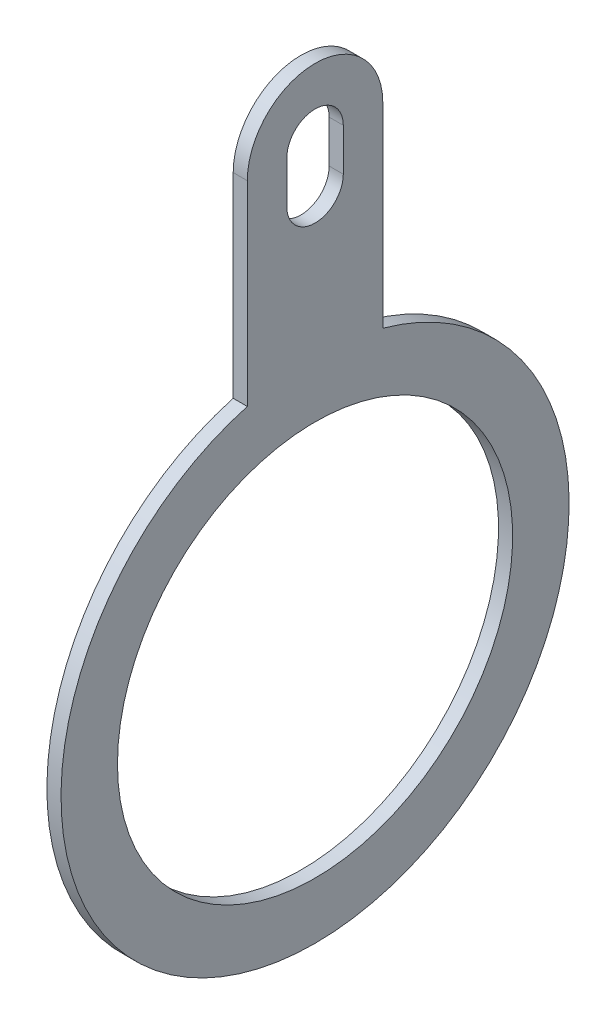
ISO-10303-21;
HEADER;
FILE_DESCRIPTION(('STEP AP214'),'2;1');
FILE_NAME('part.step','',(''),(''),'','','');
FILE_SCHEMA(('AUTOMOTIVE_DESIGN { 1 0 10303 214 1 1 1 1 }'));
ENDSEC;
DATA;
#1=APPLICATION_CONTEXT('core data for automotive mechanical design processes');
#2=APPLICATION_PROTOCOL_DEFINITION('international standard','automotive_design',2000,#1);
#3=PRODUCT_CONTEXT('',#1,'mechanical');
#4=PRODUCT('Part','Part','',(#3));
#5=PRODUCT_RELATED_PRODUCT_CATEGORY('part','',(#4));
#6=PRODUCT_DEFINITION_FORMATION('','',#4);
#7=PRODUCT_DEFINITION_CONTEXT('part definition',#1,'design');
#8=PRODUCT_DEFINITION('design','',#6,#7);
#9=PRODUCT_DEFINITION_SHAPE('','',#8);
#10=(LENGTH_UNIT() NAMED_UNIT(*) SI_UNIT(.MILLI.,.METRE.));
#11=(NAMED_UNIT(*) PLANE_ANGLE_UNIT() SI_UNIT($,.RADIAN.));
#12=(NAMED_UNIT(*) SI_UNIT($,.STERADIAN.) SOLID_ANGLE_UNIT());
#13=UNCERTAINTY_MEASURE_WITH_UNIT(LENGTH_MEASURE(1.E-05),#10,'distance_accuracy_value','');
#14=(GEOMETRIC_REPRESENTATION_CONTEXT(3) GLOBAL_UNCERTAINTY_ASSIGNED_CONTEXT((#13)) GLOBAL_UNIT_ASSIGNED_CONTEXT((#10,
#11,#12)) REPRESENTATION_CONTEXT('',''));
#15=CARTESIAN_POINT('',(0.,0.,0.));
#16=DIRECTION('',(0.,0.,1.));
#17=DIRECTION('',(1.,0.,0.));
#18=AXIS2_PLACEMENT_3D('',#15,#16,#17);
#19=CARTESIAN_POINT('',(-1.35,-102.5400760809,9.364816595064));
#20=DIRECTION('',(1.,0.,0.));
#21=DIRECTION('',(0.,0.,-1.));
#22=AXIS2_PLACEMENT_3D('',#19,#20,#21);
#23=PLANE('',#22);
#24=CARTESIAN_POINT('',(-1.34999999999981,-78.9,0.));
#25=DIRECTION('',(1.,0.,0.));
#26=DIRECTION('',(0.,0.,-1.));
#27=AXIS2_PLACEMENT_3D('',#24,#25,#26);
#28=CIRCLE('',#27,1.);
#29=CARTESIAN_POINT('',(-1.34999999999981,-78.8999999999998,-1.));
#30=VERTEX_POINT('',#29);
#31=CARTESIAN_POINT('',(-1.34999999999981,-78.8999999999981,1.));
#32=VERTEX_POINT('',#31);
#33=EDGE_CURVE('E131',#30,#32,#28,.F.);
#34=ORIENTED_EDGE('',*,*,#33,.F.);
#35=DIRECTION('',(0.,1.,0.));
#36=VECTOR('',#35,1.);
#37=CARTESIAN_POINT('',(-1.34999999999981,-78.15,-1.));
#38=LINE('',#37,#36);
#39=CARTESIAN_POINT('',(-1.34999999999981,-77.4000000000019,-1.));
#40=VERTEX_POINT('',#39);
#41=EDGE_CURVE('E109',#30,#40,#38,.T.);
#42=ORIENTED_EDGE('',*,*,#41,.T.);
#43=CARTESIAN_POINT('',(-1.34999999999981,-77.4,0.));
#44=DIRECTION('',(1.,0.,0.));
#45=DIRECTION('',(0.,0.,-1.));
#46=AXIS2_PLACEMENT_3D('',#43,#44,#45);
#47=CIRCLE('',#46,1.);
#48=CARTESIAN_POINT('',(-1.34999999999981,-77.400000000002,1.));
#49=VERTEX_POINT('',#48);
#50=EDGE_CURVE('E112',#49,#40,#47,.F.);
#51=ORIENTED_EDGE('',*,*,#50,.F.);
#52=DIRECTION('',(0.,-1.,0.));
#53=VECTOR('',#52,1.);
#54=CARTESIAN_POINT('',(-1.34999999999981,-78.15,1.));
#55=LINE('',#54,#53);
#56=EDGE_CURVE('E106',#49,#32,#55,.T.);
#57=ORIENTED_EDGE('',*,*,#56,.T.);
#58=EDGE_LOOP('',(#34,#42,#51,#57));
#59=FACE_BOUND('',#58,.T.);
#60=CARTESIAN_POINT('',(-1.34999999999983,-93.,0.));
#61=DIRECTION('',(-1.,0.,0.));
#62=DIRECTION('',(0.,0.,1.));
#63=AXIS2_PLACEMENT_3D('',#60,#61,#62);
#64=CIRCLE('',#63,7.00000000000001);
#65=CARTESIAN_POINT('',(-1.34999999999983,-93.,7.00000000000001));
#66=VERTEX_POINT('',#65);
#67=EDGE_CURVE('E136',#66,#66,#64,.T.);
#68=ORIENTED_EDGE('',*,*,#67,.F.);
#69=EDGE_LOOP('',(#68));
#70=FACE_BOUND('',#69,.T.);
#71=CARTESIAN_POINT('',(-1.34999999999981,-93.,0.));
#72=DIRECTION('',(1.,0.,0.));
#73=DIRECTION('',(0.,0.,-1.));
#74=AXIS2_PLACEMENT_3D('',#71,#72,#73);
#75=CIRCLE('',#74,9.);
#76=CARTESIAN_POINT('',(-1.34999999999981,-84.3259006231186,-2.4));
#77=VERTEX_POINT('',#76);
#78=CARTESIAN_POINT('',(-1.34999999999981,-84.3259006231191,2.3999999999987));
#79=VERTEX_POINT('',#78);
#80=EDGE_CURVE('E93',#77,#79,#75,.F.);
#81=ORIENTED_EDGE('',*,*,#80,.T.);
#82=DIRECTION('',(0.,-1.,0.));
#83=VECTOR('',#82,1.);
#84=CARTESIAN_POINT('',(-1.34999999999981,-80.86295031156,2.4));
#85=LINE('',#84,#83);
#86=CARTESIAN_POINT('',(-1.34999999999981,-77.4000000000012,2.4));
#87=VERTEX_POINT('',#86);
#88=EDGE_CURVE('E92',#87,#79,#85,.T.);
#89=ORIENTED_EDGE('',*,*,#88,.F.);
#90=CARTESIAN_POINT('',(-1.34999999999981,-77.4,0.));
#91=DIRECTION('',(1.,0.,0.));
#92=DIRECTION('',(0.,0.,-1.));
#93=AXIS2_PLACEMENT_3D('',#90,#91,#92);
#94=CIRCLE('',#93,2.4);
#95=CARTESIAN_POINT('',(-1.34999999999981,-77.4000000000015,-2.4));
#96=VERTEX_POINT('',#95);
#97=EDGE_CURVE('E21',#87,#96,#94,.F.);
#98=ORIENTED_EDGE('',*,*,#97,.T.);
#99=DIRECTION('',(0.,1.,0.));
#100=VECTOR('',#99,1.);
#101=CARTESIAN_POINT('',(-1.34999999999981,-80.86295031156,-2.4));
#102=LINE('',#101,#100);
#103=EDGE_CURVE('E113',#77,#96,#102,.T.);
#104=ORIENTED_EDGE('',*,*,#103,.F.);
#105=EDGE_LOOP('',(#81,#89,#98,#104));
#106=FACE_BOUND('',#105,.T.);
#107=ADVANCED_FACE('F17',(#59,#70,#106),#23,.F.);
#108=CARTESIAN_POINT('',(-1.34999999999981,-77.4,0.));
#109=DIRECTION('',(1.,0.,0.));
#110=DIRECTION('',(0.,0.,-1.));
#111=AXIS2_PLACEMENT_3D('',#108,#109,#110);
#112=CYLINDRICAL_SURFACE('',#111,2.4);
#113=ORIENTED_EDGE('',*,*,#97,.F.);
#114=DIRECTION('',(-1.,0.,0.));
#115=VECTOR('',#114,1.);
#116=CARTESIAN_POINT('',(-1.0999999999999,-77.4000000000023,2.4));
#117=LINE('',#116,#115);
#118=CARTESIAN_POINT('',(-0.849999999999984,-77.4000000000012,2.4));
#119=VERTEX_POINT('',#118);
#120=EDGE_CURVE('E84',#119,#87,#117,.T.);
#121=ORIENTED_EDGE('',*,*,#120,.F.);
#122=CARTESIAN_POINT('',(-0.849999999999968,-77.4,0.));
#123=DIRECTION('',(1.,0.,0.));
#124=DIRECTION('',(0.,0.,-1.));
#125=AXIS2_PLACEMENT_3D('',#122,#123,#124);
#126=CIRCLE('',#125,2.4);
#127=CARTESIAN_POINT('',(-0.849999999999984,-77.4000000000015,-2.4));
#128=VERTEX_POINT('',#127);
#129=EDGE_CURVE('E129',#128,#119,#126,.T.);
#130=ORIENTED_EDGE('',*,*,#129,.F.);
#131=DIRECTION('',(1.,0.,0.));
#132=VECTOR('',#131,1.);
#133=CARTESIAN_POINT('',(-1.0999999999999,-77.4000000000029,-2.4));
#134=LINE('',#133,#132);
#135=EDGE_CURVE('E87',#96,#128,#134,.T.);
#136=ORIENTED_EDGE('',*,*,#135,.F.);
#137=EDGE_LOOP('',(#113,#121,#130,#136));
#138=FACE_BOUND('',#137,.T.);
#139=ADVANCED_FACE('F82',(#138),#112,.T.);
#140=CARTESIAN_POINT('',(-1.391674567784,-77.26148198754,2.4));
#141=DIRECTION('',(0.,0.,1.));
#142=DIRECTION('',(0.,-1.,0.));
#143=AXIS2_PLACEMENT_3D('',#140,#141,#142);
#144=PLANE('',#143);
#145=ORIENTED_EDGE('',*,*,#88,.T.);
#146=DIRECTION('',(1.,0.,0.));
#147=VECTOR('',#146,1.);
#148=CARTESIAN_POINT('',(-1.0999999999999,-84.3259006231187,2.3999999999974));
#149=LINE('',#148,#147);
#150=CARTESIAN_POINT('',(-0.849999999999968,-84.3259006231191,2.3999999999987));
#151=VERTEX_POINT('',#150);
#152=EDGE_CURVE('E104',#79,#151,#149,.T.);
#153=ORIENTED_EDGE('',*,*,#152,.T.);
#154=DIRECTION('',(0.,-1.,0.));
#155=VECTOR('',#154,1.);
#156=CARTESIAN_POINT('',(-0.85,-88.49809797662,2.4));
#157=LINE('',#156,#155);
#158=EDGE_CURVE('E99',#119,#151,#157,.T.);
#159=ORIENTED_EDGE('',*,*,#158,.F.);
#160=ORIENTED_EDGE('',*,*,#120,.T.);
#161=EDGE_LOOP('',(#145,#153,#159,#160));
#162=FACE_BOUND('',#161,.T.);
#163=ADVANCED_FACE('F97',(#162),#144,.T.);
#164=CARTESIAN_POINT('',(-1.34999999999981,-93.,0.));
#165=DIRECTION('',(1.,0.,0.));
#166=DIRECTION('',(0.,0.,-1.));
#167=AXIS2_PLACEMENT_3D('',#164,#165,#166);
#168=CYLINDRICAL_SURFACE('',#167,9.);
#169=ORIENTED_EDGE('',*,*,#80,.F.);
#170=DIRECTION('',(-1.,0.,0.));
#171=VECTOR('',#170,1.);
#172=CARTESIAN_POINT('',(-1.0999999999999,-84.3259006231177,-2.4));
#173=LINE('',#172,#171);
#174=CARTESIAN_POINT('',(-0.849999999999984,-84.3259006231186,-2.4));
#175=VERTEX_POINT('',#174);
#176=EDGE_CURVE('E114',#175,#77,#173,.T.);
#177=ORIENTED_EDGE('',*,*,#176,.F.);
#178=CARTESIAN_POINT('',(-0.849999999999968,-93.,0.));
#179=DIRECTION('',(1.,0.,0.));
#180=DIRECTION('',(0.,0.,-1.));
#181=AXIS2_PLACEMENT_3D('',#178,#179,#180);
#182=CIRCLE('',#181,9.);
#183=EDGE_CURVE('E126',#151,#175,#182,.T.);
#184=ORIENTED_EDGE('',*,*,#183,.F.);
#185=ORIENTED_EDGE('',*,*,#152,.F.);
#186=EDGE_LOOP('',(#169,#177,#184,#185));
#187=FACE_BOUND('',#186,.T.);
#188=ADVANCED_FACE('F231',(#187),#168,.T.);
#189=CARTESIAN_POINT('',(-1.391674567784,-84.46441863558,-2.4));
#190=DIRECTION('',(0.,0.,-1.));
#191=DIRECTION('',(0.,1.,0.));
#192=AXIS2_PLACEMENT_3D('',#189,#190,#191);
#193=PLANE('',#192);
#194=ORIENTED_EDGE('',*,*,#103,.T.);
#195=ORIENTED_EDGE('',*,*,#135,.T.);
#196=DIRECTION('',(0.,1.,0.));
#197=VECTOR('',#196,1.);
#198=CARTESIAN_POINT('',(-0.85,-88.49809797662,-2.4));
#199=LINE('',#198,#197);
#200=EDGE_CURVE('E125',#175,#128,#199,.T.);
#201=ORIENTED_EDGE('',*,*,#200,.F.);
#202=ORIENTED_EDGE('',*,*,#176,.T.);
#203=EDGE_LOOP('',(#194,#195,#201,#202));
#204=FACE_BOUND('',#203,.T.);
#205=ADVANCED_FACE('F146',(#204),#193,.T.);
#206=CARTESIAN_POINT('',(-0.849999999999985,-93.,0.));
#207=DIRECTION('',(-1.,0.,0.));
#208=DIRECTION('',(0.,0.,1.));
#209=AXIS2_PLACEMENT_3D('',#206,#207,#208);
#210=CYLINDRICAL_SURFACE('',#209,7.00000000000001);
#211=ORIENTED_EDGE('',*,*,#67,.T.);
#212=EDGE_LOOP('',(#211));
#213=FACE_BOUND('',#212,.T.);
#214=CARTESIAN_POINT('',(-0.849999999999985,-93.,0.));
#215=DIRECTION('',(-1.,0.,0.));
#216=DIRECTION('',(0.,0.,1.));
#217=AXIS2_PLACEMENT_3D('',#214,#215,#216);
#218=CIRCLE('',#217,7.00000000000001);
#219=CARTESIAN_POINT('',(-0.849999999999985,-93.,7.00000000000001));
#220=VERTEX_POINT('',#219);
#221=EDGE_CURVE('E122',#220,#220,#218,.T.);
#222=ORIENTED_EDGE('',*,*,#221,.F.);
#223=EDGE_LOOP('',(#222));
#224=FACE_BOUND('',#223,.T.);
#225=ADVANCED_FACE('F214',(#213,#224),#210,.F.);
#226=CARTESIAN_POINT('',(-1.34999999999981,-77.4,0.));
#227=DIRECTION('',(1.,0.,0.));
#228=DIRECTION('',(0.,0.,-1.));
#229=AXIS2_PLACEMENT_3D('',#226,#227,#228);
#230=CYLINDRICAL_SURFACE('',#229,1.);
#231=ORIENTED_EDGE('',*,*,#50,.T.);
#232=DIRECTION('',(1.,0.,0.));
#233=VECTOR('',#232,1.);
#234=CARTESIAN_POINT('',(-1.0999999999999,-77.4000000000038,-1.));
#235=LINE('',#234,#233);
#236=CARTESIAN_POINT('',(-0.849999999999984,-77.4000000000019,-0.999999999999999));
#237=VERTEX_POINT('',#236);
#238=EDGE_CURVE('E111',#40,#237,#235,.T.);
#239=ORIENTED_EDGE('',*,*,#238,.T.);
#240=CARTESIAN_POINT('',(-0.849999999999968,-77.4,0.));
#241=DIRECTION('',(1.,0.,0.));
#242=DIRECTION('',(0.,0.,-1.));
#243=AXIS2_PLACEMENT_3D('',#240,#241,#242);
#244=CIRCLE('',#243,1.);
#245=CARTESIAN_POINT('',(-0.849999999999984,-77.400000000002,0.999999999999999));
#246=VERTEX_POINT('',#245);
#247=EDGE_CURVE('E119',#246,#237,#244,.F.);
#248=ORIENTED_EDGE('',*,*,#247,.F.);
#249=DIRECTION('',(-1.,0.,0.));
#250=VECTOR('',#249,1.);
#251=CARTESIAN_POINT('',(-1.0999999999999,-77.400000000004,1.));
#252=LINE('',#251,#250);
#253=EDGE_CURVE('E108',#246,#49,#252,.T.);
#254=ORIENTED_EDGE('',*,*,#253,.T.);
#255=EDGE_LOOP('',(#231,#239,#248,#254));
#256=FACE_BOUND('',#255,.T.);
#257=ADVANCED_FACE('F158',(#256),#230,.F.);
#258=CARTESIAN_POINT('',(-1.391674567784,-78.94167456778,-1.));
#259=DIRECTION('',(0.,0.,-1.));
#260=DIRECTION('',(0.,1.,0.));
#261=AXIS2_PLACEMENT_3D('',#258,#259,#260);
#262=PLANE('',#261);
#263=ORIENTED_EDGE('',*,*,#41,.F.);
#264=DIRECTION('',(-1.,0.,0.));
#265=VECTOR('',#264,1.);
#266=CARTESIAN_POINT('',(-1.0999999999999,-78.8999999999996,-1.));
#267=LINE('',#266,#265);
#268=CARTESIAN_POINT('',(-0.849999999999984,-78.8999999999998,-0.999999999999999));
#269=VERTEX_POINT('',#268);
#270=EDGE_CURVE('E133',#269,#30,#267,.T.);
#271=ORIENTED_EDGE('',*,*,#270,.F.);
#272=DIRECTION('',(0.,-1.,0.));
#273=VECTOR('',#272,1.);
#274=CARTESIAN_POINT('',(-0.85,-88.49809797662,-0.999999999999999));
#275=LINE('',#274,#273);
#276=EDGE_CURVE('E118',#237,#269,#275,.T.);
#277=ORIENTED_EDGE('',*,*,#276,.F.);
#278=ORIENTED_EDGE('',*,*,#238,.F.);
#279=EDGE_LOOP('',(#263,#271,#277,#278));
#280=FACE_BOUND('',#279,.T.);
#281=ADVANCED_FACE('F162',(#280),#262,.F.);
#282=CARTESIAN_POINT('',(-1.34999999999981,-78.9,0.));
#283=DIRECTION('',(1.,0.,0.));
#284=DIRECTION('',(0.,0.,-1.));
#285=AXIS2_PLACEMENT_3D('',#282,#283,#284);
#286=CYLINDRICAL_SURFACE('',#285,1.);
#287=ORIENTED_EDGE('',*,*,#33,.T.);
#288=DIRECTION('',(1.,0.,0.));
#289=VECTOR('',#288,1.);
#290=CARTESIAN_POINT('',(-1.0999999999999,-78.8999999999962,1.));
#291=LINE('',#290,#289);
#292=CARTESIAN_POINT('',(-0.849999999999984,-78.8999999999981,0.999999999999999));
#293=VERTEX_POINT('',#292);
#294=EDGE_CURVE('E36',#32,#293,#291,.T.);
#295=ORIENTED_EDGE('',*,*,#294,.T.);
#296=CARTESIAN_POINT('',(-0.849999999999968,-78.9,0.));
#297=DIRECTION('',(1.,0.,0.));
#298=DIRECTION('',(0.,0.,-1.));
#299=AXIS2_PLACEMENT_3D('',#296,#297,#298);
#300=CIRCLE('',#299,1.);
#301=EDGE_CURVE('E27',#269,#293,#300,.F.);
#302=ORIENTED_EDGE('',*,*,#301,.F.);
#303=ORIENTED_EDGE('',*,*,#270,.T.);
#304=EDGE_LOOP('',(#287,#295,#302,#303));
#305=FACE_BOUND('',#304,.T.);
#306=ADVANCED_FACE('F171',(#305),#286,.F.);
#307=CARTESIAN_POINT('',(-1.391674567784,-77.35832543222,1.));
#308=DIRECTION('',(0.,0.,1.));
#309=DIRECTION('',(0.,-1.,0.));
#310=AXIS2_PLACEMENT_3D('',#307,#308,#309);
#311=PLANE('',#310);
#312=ORIENTED_EDGE('',*,*,#56,.F.);
#313=ORIENTED_EDGE('',*,*,#253,.F.);
#314=DIRECTION('',(0.,1.,0.));
#315=VECTOR('',#314,1.);
#316=CARTESIAN_POINT('',(-0.85,-88.49809797662,0.999999999999999));
#317=LINE('',#316,#315);
#318=EDGE_CURVE('E11',#293,#246,#317,.T.);
#319=ORIENTED_EDGE('',*,*,#318,.F.);
#320=ORIENTED_EDGE('',*,*,#294,.F.);
#321=EDGE_LOOP('',(#312,#313,#319,#320));
#322=FACE_BOUND('',#321,.T.);
#323=ADVANCED_FACE('F167',(#322),#311,.F.);
#324=CARTESIAN_POINT('',(-0.85,-102.5400760809,9.364816595064));
#325=DIRECTION('',(1.,0.,0.));
#326=DIRECTION('',(0.,0.,-1.));
#327=AXIS2_PLACEMENT_3D('',#324,#325,#326);
#328=PLANE('',#327);
#329=ORIENTED_EDGE('',*,*,#301,.T.);
#330=ORIENTED_EDGE('',*,*,#318,.T.);
#331=ORIENTED_EDGE('',*,*,#247,.T.);
#332=ORIENTED_EDGE('',*,*,#276,.T.);
#333=EDGE_LOOP('',(#329,#330,#331,#332));
#334=FACE_BOUND('',#333,.T.);
#335=ORIENTED_EDGE('',*,*,#221,.T.);
#336=EDGE_LOOP('',(#335));
#337=FACE_BOUND('',#336,.T.);
#338=ORIENTED_EDGE('',*,*,#183,.T.);
#339=ORIENTED_EDGE('',*,*,#200,.T.);
#340=ORIENTED_EDGE('',*,*,#129,.T.);
#341=ORIENTED_EDGE('',*,*,#158,.T.);
#342=EDGE_LOOP('',(#338,#339,#340,#341));
#343=FACE_BOUND('',#342,.T.);
#344=ADVANCED_FACE('F19',(#334,#337,#343),#328,.T.);
#345=CLOSED_SHELL('',(#107,#139,#163,#188,#205,#225,#257,#281,#306,#323,#344));
#346=MANIFOLD_SOLID_BREP('B1',#345);
#347=ADVANCED_BREP_SHAPE_REPRESENTATION('',(#18,#346),#14);
#348=SHAPE_DEFINITION_REPRESENTATION(#9,#347);
ENDSEC;
END-ISO-10303-21;
